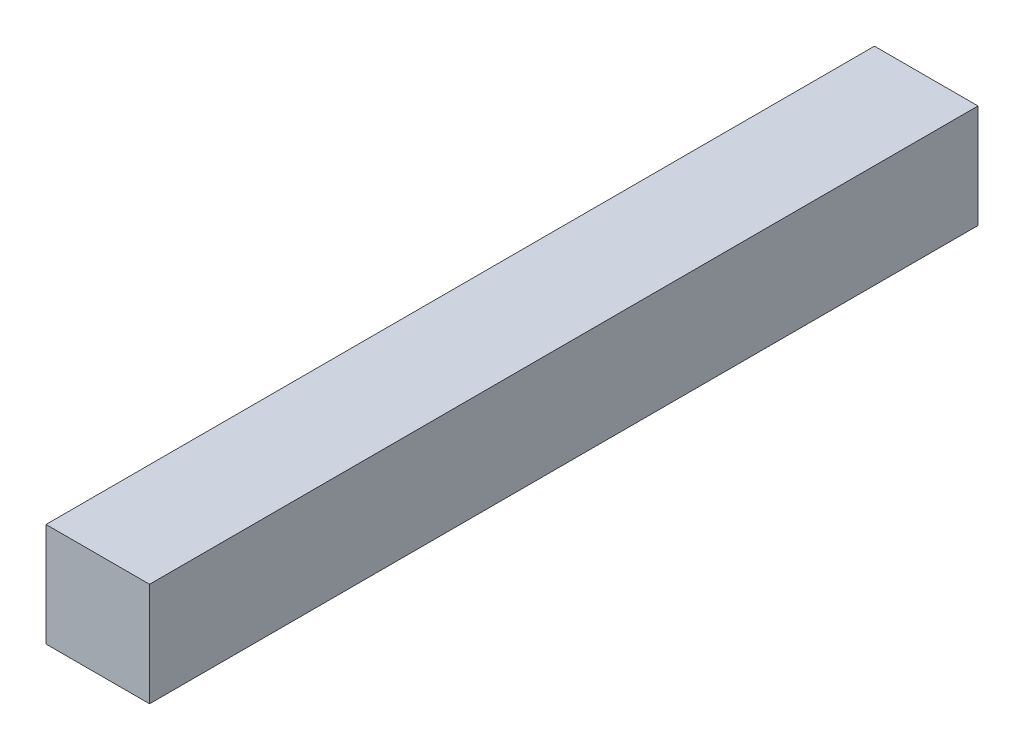
ISO-10303-21;
HEADER;
FILE_DESCRIPTION(('STEP AP214'),'2;1');
FILE_NAME('part.step','',(''),(''),'','','');
FILE_SCHEMA(('AUTOMOTIVE_DESIGN { 1 0 10303 214 1 1 1 1 }'));
ENDSEC;
DATA;
#1=APPLICATION_CONTEXT('core data for automotive mechanical design processes');
#2=APPLICATION_PROTOCOL_DEFINITION('international standard','automotive_design',2000,#1);
#3=PRODUCT_CONTEXT('',#1,'mechanical');
#4=PRODUCT('Part','Part','',(#3));
#5=PRODUCT_RELATED_PRODUCT_CATEGORY('part','',(#4));
#6=PRODUCT_DEFINITION_FORMATION('','',#4);
#7=PRODUCT_DEFINITION_CONTEXT('part definition',#1,'design');
#8=PRODUCT_DEFINITION('design','',#6,#7);
#9=PRODUCT_DEFINITION_SHAPE('','',#8);
#10=(LENGTH_UNIT() NAMED_UNIT(*) SI_UNIT(.MILLI.,.METRE.));
#11=(NAMED_UNIT(*) PLANE_ANGLE_UNIT() SI_UNIT($,.RADIAN.));
#12=(NAMED_UNIT(*) SI_UNIT($,.STERADIAN.) SOLID_ANGLE_UNIT());
#13=UNCERTAINTY_MEASURE_WITH_UNIT(LENGTH_MEASURE(1.E-05),#10,'distance_accuracy_value','');
#14=(GEOMETRIC_REPRESENTATION_CONTEXT(3) GLOBAL_UNCERTAINTY_ASSIGNED_CONTEXT((#13)) GLOBAL_UNIT_ASSIGNED_CONTEXT((#10,
#11,#12)) REPRESENTATION_CONTEXT('',''));
#15=CARTESIAN_POINT('',(0.,0.,0.));
#16=DIRECTION('',(0.,0.,1.));
#17=DIRECTION('',(1.,0.,0.));
#18=AXIS2_PLACEMENT_3D('',#15,#16,#17);
#19=CARTESIAN_POINT('',(-2.28,-0.77000000000001,0.4));
#20=DIRECTION('',(1.,0.,0.));
#21=DIRECTION('',(0.,1.,0.));
#22=AXIS2_PLACEMENT_3D('',#19,#20,#21);
#23=PLANE('',#22);
#24=DIRECTION('',(0.,1.,0.));
#25=VECTOR('',#24,1.);
#26=CARTESIAN_POINT('',(-2.28,-0.520000000000007,4.4));
#27=LINE('',#26,#25);
#28=CARTESIAN_POINT('',(-2.28,-0.77000000000001,4.4));
#29=VERTEX_POINT('',#28);
#30=CARTESIAN_POINT('',(-2.28,-0.270000000000003,4.4));
#31=VERTEX_POINT('',#30);
#32=EDGE_CURVE('E55',#29,#31,#27,.T.);
#33=ORIENTED_EDGE('',*,*,#32,.F.);
#34=DIRECTION('',(0.,0.,1.));
#35=VECTOR('',#34,1.);
#36=CARTESIAN_POINT('',(-2.28,-0.77000000000001,0.4));
#37=LINE('',#36,#35);
#38=CARTESIAN_POINT('',(-2.28,-0.77000000000001,0.4));
#39=VERTEX_POINT('',#38);
#40=EDGE_CURVE('E67',#39,#29,#37,.T.);
#41=ORIENTED_EDGE('',*,*,#40,.F.);
#42=DIRECTION('',(0.,1.,0.));
#43=VECTOR('',#42,1.);
#44=CARTESIAN_POINT('',(-2.28,-0.520000000000007,0.4));
#45=LINE('',#44,#43);
#46=CARTESIAN_POINT('',(-2.28,-0.270000000000003,0.4));
#47=VERTEX_POINT('',#46);
#48=EDGE_CURVE('E20',#39,#47,#45,.T.);
#49=ORIENTED_EDGE('',*,*,#48,.T.);
#50=DIRECTION('',(0.,0.,1.));
#51=VECTOR('',#50,1.);
#52=CARTESIAN_POINT('',(-2.28,-0.270000000000003,0.4));
#53=LINE('',#52,#51);
#54=EDGE_CURVE('E81',#31,#47,#53,.F.);
#55=ORIENTED_EDGE('',*,*,#54,.F.);
#56=EDGE_LOOP('',(#33,#41,#49,#55));
#57=FACE_BOUND('',#56,.T.);
#58=ADVANCED_FACE('F17',(#57),#23,.T.);
#59=CARTESIAN_POINT('',(-2.53,-0.520000000000007,0.4));
#60=DIRECTION('',(0.,0.,1.));
#61=DIRECTION('',(1.,0.,0.));
#62=AXIS2_PLACEMENT_3D('',#59,#60,#61);
#63=PLANE('',#62);
#64=DIRECTION('',(1.,0.,0.));
#65=VECTOR('',#64,1.);
#66=CARTESIAN_POINT('',(-2.78,-0.77000000000001,0.4));
#67=LINE('',#66,#65);
#68=CARTESIAN_POINT('',(-2.78,-0.77000000000001,0.4));
#69=VERTEX_POINT('',#68);
#70=EDGE_CURVE('E62',#69,#39,#67,.T.);
#71=ORIENTED_EDGE('',*,*,#70,.F.);
#72=DIRECTION('',(0.,-1.,0.));
#73=VECTOR('',#72,1.);
#74=CARTESIAN_POINT('',(-2.78,-0.270000000000003,0.4));
#75=LINE('',#74,#73);
#76=CARTESIAN_POINT('',(-2.78,-0.270000000000003,0.4));
#77=VERTEX_POINT('',#76);
#78=EDGE_CURVE('E83',#77,#69,#75,.T.);
#79=ORIENTED_EDGE('',*,*,#78,.F.);
#80=DIRECTION('',(-1.,0.,0.));
#81=VECTOR('',#80,1.);
#82=CARTESIAN_POINT('',(-2.28,-0.270000000000003,0.4));
#83=LINE('',#82,#81);
#84=EDGE_CURVE('E65',#47,#77,#83,.T.);
#85=ORIENTED_EDGE('',*,*,#84,.F.);
#86=ORIENTED_EDGE('',*,*,#48,.F.);
#87=EDGE_LOOP('',(#71,#79,#85,#86));
#88=FACE_BOUND('',#87,.T.);
#89=ADVANCED_FACE('F60',(#88),#63,.F.);
#90=CARTESIAN_POINT('',(-2.78,-0.77000000000001,0.4));
#91=DIRECTION('',(0.,-1.,0.));
#92=DIRECTION('',(1.,0.,0.));
#93=AXIS2_PLACEMENT_3D('',#90,#91,#92);
#94=PLANE('',#93);
#95=DIRECTION('',(1.,0.,0.));
#96=VECTOR('',#95,1.);
#97=CARTESIAN_POINT('',(-2.53,-0.77000000000001,4.4));
#98=LINE('',#97,#96);
#99=CARTESIAN_POINT('',(-2.78,-0.77000000000001,4.4));
#100=VERTEX_POINT('',#99);
#101=EDGE_CURVE('E77',#100,#29,#98,.T.);
#102=ORIENTED_EDGE('',*,*,#101,.F.);
#103=DIRECTION('',(0.,0.,1.));
#104=VECTOR('',#103,1.);
#105=CARTESIAN_POINT('',(-2.78,-0.77000000000001,0.4));
#106=LINE('',#105,#104);
#107=EDGE_CURVE('E73',#69,#100,#106,.T.);
#108=ORIENTED_EDGE('',*,*,#107,.F.);
#109=ORIENTED_EDGE('',*,*,#70,.T.);
#110=ORIENTED_EDGE('',*,*,#40,.T.);
#111=EDGE_LOOP('',(#102,#108,#109,#110));
#112=FACE_BOUND('',#111,.T.);
#113=ADVANCED_FACE('F71',(#112),#94,.T.);
#114=CARTESIAN_POINT('',(-2.53,-0.520000000000007,4.4));
#115=DIRECTION('',(0.,0.,1.));
#116=DIRECTION('',(1.,0.,0.));
#117=AXIS2_PLACEMENT_3D('',#114,#115,#116);
#118=PLANE('',#117);
#119=DIRECTION('',(0.,-1.,0.));
#120=VECTOR('',#119,1.);
#121=CARTESIAN_POINT('',(-2.78,-0.270000000000003,4.4));
#122=LINE('',#121,#120);
#123=CARTESIAN_POINT('',(-2.78,-0.270000000000003,4.4));
#124=VERTEX_POINT('',#123);
#125=EDGE_CURVE('E26',#100,#124,#122,.F.);
#126=ORIENTED_EDGE('',*,*,#125,.F.);
#127=ORIENTED_EDGE('',*,*,#101,.T.);
#128=ORIENTED_EDGE('',*,*,#32,.T.);
#129=DIRECTION('',(-1.,0.,0.));
#130=VECTOR('',#129,1.);
#131=CARTESIAN_POINT('',(-2.28,-0.270000000000003,4.4));
#132=LINE('',#131,#130);
#133=EDGE_CURVE('E35',#124,#31,#132,.F.);
#134=ORIENTED_EDGE('',*,*,#133,.F.);
#135=EDGE_LOOP('',(#126,#127,#128,#134));
#136=FACE_BOUND('',#135,.T.);
#137=ADVANCED_FACE('F89',(#136),#118,.T.);
#138=CARTESIAN_POINT('',(-2.28,-0.270000000000003,0.4));
#139=DIRECTION('',(0.,1.,0.));
#140=DIRECTION('',(-1.,0.,0.));
#141=AXIS2_PLACEMENT_3D('',#138,#139,#140);
#142=PLANE('',#141);
#143=ORIENTED_EDGE('',*,*,#133,.T.);
#144=ORIENTED_EDGE('',*,*,#54,.T.);
#145=ORIENTED_EDGE('',*,*,#84,.T.);
#146=DIRECTION('',(0.,0.,1.));
#147=VECTOR('',#146,1.);
#148=CARTESIAN_POINT('',(-2.78,-0.270000000000003,0.4));
#149=LINE('',#148,#147);
#150=EDGE_CURVE('E11',#124,#77,#149,.F.);
#151=ORIENTED_EDGE('',*,*,#150,.F.);
#152=EDGE_LOOP('',(#143,#144,#145,#151));
#153=FACE_BOUND('',#152,.T.);
#154=ADVANCED_FACE('F91',(#153),#142,.T.);
#155=CARTESIAN_POINT('',(-2.78,-0.270000000000003,0.4));
#156=DIRECTION('',(-1.,0.,0.));
#157=DIRECTION('',(0.,-1.,0.));
#158=AXIS2_PLACEMENT_3D('',#155,#156,#157);
#159=PLANE('',#158);
#160=ORIENTED_EDGE('',*,*,#125,.T.);
#161=ORIENTED_EDGE('',*,*,#150,.T.);
#162=ORIENTED_EDGE('',*,*,#78,.T.);
#163=ORIENTED_EDGE('',*,*,#107,.T.);
#164=EDGE_LOOP('',(#160,#161,#162,#163));
#165=FACE_BOUND('',#164,.T.);
#166=ADVANCED_FACE('F88',(#165),#159,.T.);
#167=CLOSED_SHELL('',(#58,#89,#113,#137,#154,#166));
#168=MANIFOLD_SOLID_BREP('B1',#167);
#169=ADVANCED_BREP_SHAPE_REPRESENTATION('',(#18,#168),#14);
#170=SHAPE_DEFINITION_REPRESENTATION(#9,#169);
ENDSEC;
END-ISO-10303-21;
